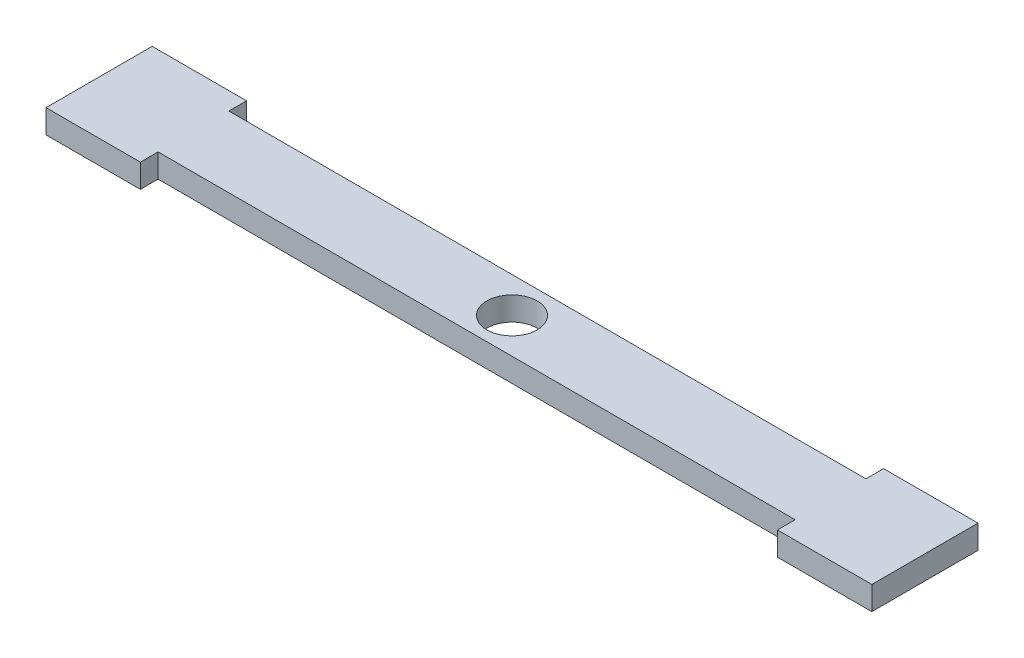
ISO-10303-21;
HEADER;
FILE_DESCRIPTION(('STEP AP214'),'2;1');
FILE_NAME('part.step','',(''),(''),'','','');
FILE_SCHEMA(('AUTOMOTIVE_DESIGN { 1 0 10303 214 1 1 1 1 }'));
ENDSEC;
DATA;
#1=APPLICATION_CONTEXT('core data for automotive mechanical design processes');
#2=APPLICATION_PROTOCOL_DEFINITION('international standard','automotive_design',2000,#1);
#3=PRODUCT_CONTEXT('',#1,'mechanical');
#4=PRODUCT('Part','Part','',(#3));
#5=PRODUCT_RELATED_PRODUCT_CATEGORY('part','',(#4));
#6=PRODUCT_DEFINITION_FORMATION('','',#4);
#7=PRODUCT_DEFINITION_CONTEXT('part definition',#1,'design');
#8=PRODUCT_DEFINITION('design','',#6,#7);
#9=PRODUCT_DEFINITION_SHAPE('','',#8);
#10=(LENGTH_UNIT() NAMED_UNIT(*) SI_UNIT(.MILLI.,.METRE.));
#11=(NAMED_UNIT(*) PLANE_ANGLE_UNIT() SI_UNIT($,.RADIAN.));
#12=(NAMED_UNIT(*) SI_UNIT($,.STERADIAN.) SOLID_ANGLE_UNIT());
#13=UNCERTAINTY_MEASURE_WITH_UNIT(LENGTH_MEASURE(1.E-05),#10,'distance_accuracy_value','');
#14=(GEOMETRIC_REPRESENTATION_CONTEXT(3) GLOBAL_UNCERTAINTY_ASSIGNED_CONTEXT((#13)) GLOBAL_UNIT_ASSIGNED_CONTEXT((#10,
#11,#12)) REPRESENTATION_CONTEXT('',''));
#15=CARTESIAN_POINT('',(0.,0.,0.));
#16=DIRECTION('',(0.,0.,1.));
#17=DIRECTION('',(1.,0.,0.));
#18=AXIS2_PLACEMENT_3D('',#15,#16,#17);
#19=CARTESIAN_POINT('',(0.,10.,0.));
#20=DIRECTION('',(0.,1.,0.));
#21=DIRECTION('',(0.,0.,1.));
#22=AXIS2_PLACEMENT_3D('',#19,#20,#21);
#23=PLANE('',#22);
#24=DIRECTION('',(0.,0.,1.));
#25=VECTOR('',#24,1.);
#26=CARTESIAN_POINT('',(-73.2906760748949,10.,20.));
#27=LINE('',#26,#25);
#28=CARTESIAN_POINT('',(-73.2906760748949,10.,-25.));
#29=VERTEX_POINT('',#28);
#30=CARTESIAN_POINT('',(-73.2906760748949,10.,20.));
#31=VERTEX_POINT('',#30);
#32=EDGE_CURVE('E177',#29,#31,#27,.T.);
#33=ORIENTED_EDGE('',*,*,#32,.T.);
#34=DIRECTION('',(1.,0.,0.));
#35=VECTOR('',#34,1.);
#36=CARTESIAN_POINT('',(-33.290676074895,10.,20.));
#37=LINE('',#36,#35);
#38=CARTESIAN_POINT('',(-33.290676074895,10.,20.));
#39=VERTEX_POINT('',#38);
#40=EDGE_CURVE('E105',#31,#39,#37,.T.);
#41=ORIENTED_EDGE('',*,*,#40,.T.);
#42=DIRECTION('',(0.,0.,-1.));
#43=VECTOR('',#42,1.);
#44=CARTESIAN_POINT('',(-33.290676074895,10.,20.));
#45=LINE('',#44,#43);
#46=CARTESIAN_POINT('',(-33.290676074895,10.,12.5));
#47=VERTEX_POINT('',#46);
#48=EDGE_CURVE('E204',#39,#47,#45,.T.);
#49=ORIENTED_EDGE('',*,*,#48,.T.);
#50=DIRECTION('',(1.,0.,0.));
#51=VECTOR('',#50,1.);
#52=CARTESIAN_POINT('',(-33.290676074895,10.,12.5));
#53=LINE('',#52,#51);
#54=CARTESIAN_POINT('',(236.709323925105,10.,12.5));
#55=VERTEX_POINT('',#54);
#56=EDGE_CURVE('E223',#47,#55,#53,.T.);
#57=ORIENTED_EDGE('',*,*,#56,.T.);
#58=DIRECTION('',(0.,0.,1.));
#59=VECTOR('',#58,1.);
#60=CARTESIAN_POINT('',(236.709323925105,10.,20.));
#61=LINE('',#60,#59);
#62=CARTESIAN_POINT('',(236.709323925105,10.,20.));
#63=VERTEX_POINT('',#62);
#64=EDGE_CURVE('E220',#55,#63,#61,.T.);
#65=ORIENTED_EDGE('',*,*,#64,.T.);
#66=DIRECTION('',(1.,0.,0.));
#67=VECTOR('',#66,1.);
#68=CARTESIAN_POINT('',(276.709323925105,10.,20.));
#69=LINE('',#68,#67);
#70=CARTESIAN_POINT('',(276.709323925105,10.,20.));
#71=VERTEX_POINT('',#70);
#72=EDGE_CURVE('E222',#63,#71,#69,.T.);
#73=ORIENTED_EDGE('',*,*,#72,.T.);
#74=DIRECTION('',(0.,0.,-1.));
#75=VECTOR('',#74,1.);
#76=CARTESIAN_POINT('',(276.709323925105,10.,20.));
#77=LINE('',#76,#75);
#78=CARTESIAN_POINT('',(276.709323925105,10.,-25.));
#79=VERTEX_POINT('',#78);
#80=EDGE_CURVE('E225',#71,#79,#77,.T.);
#81=ORIENTED_EDGE('',*,*,#80,.T.);
#82=DIRECTION('',(-1.,0.,0.));
#83=VECTOR('',#82,1.);
#84=CARTESIAN_POINT('',(276.709323925105,10.,-25.));
#85=LINE('',#84,#83);
#86=CARTESIAN_POINT('',(236.709323925105,10.,-25.));
#87=VERTEX_POINT('',#86);
#88=EDGE_CURVE('E231',#79,#87,#85,.T.);
#89=ORIENTED_EDGE('',*,*,#88,.T.);
#90=DIRECTION('',(0.,0.,1.));
#91=VECTOR('',#90,1.);
#92=CARTESIAN_POINT('',(236.709323925105,10.,-17.5));
#93=LINE('',#92,#91);
#94=CARTESIAN_POINT('',(236.709323925105,10.,-17.5));
#95=VERTEX_POINT('',#94);
#96=EDGE_CURVE('E136',#87,#95,#93,.T.);
#97=ORIENTED_EDGE('',*,*,#96,.T.);
#98=DIRECTION('',(-1.,0.,0.));
#99=VECTOR('',#98,1.);
#100=CARTESIAN_POINT('',(-33.290676074895,10.,-17.5));
#101=LINE('',#100,#99);
#102=CARTESIAN_POINT('',(-33.290676074895,10.,-17.5));
#103=VERTEX_POINT('',#102);
#104=EDGE_CURVE('E130',#95,#103,#101,.T.);
#105=ORIENTED_EDGE('',*,*,#104,.T.);
#106=DIRECTION('',(0.,0.,-1.));
#107=VECTOR('',#106,1.);
#108=CARTESIAN_POINT('',(-33.290676074895,10.,-17.5));
#109=LINE('',#108,#107);
#110=CARTESIAN_POINT('',(-33.290676074895,10.,-25.));
#111=VERTEX_POINT('',#110);
#112=EDGE_CURVE('E134',#103,#111,#109,.T.);
#113=ORIENTED_EDGE('',*,*,#112,.T.);
#114=DIRECTION('',(-1.,0.,0.));
#115=VECTOR('',#114,1.);
#116=CARTESIAN_POINT('',(-33.290676074895,10.,-25.));
#117=LINE('',#116,#115);
#118=EDGE_CURVE('E50',#111,#29,#117,.T.);
#119=ORIENTED_EDGE('',*,*,#118,.T.);
#120=EDGE_LOOP('',(#33,#41,#49,#57,#65,#73,#81,#89,#97,#105,#113,#119));
#121=FACE_BOUND('',#120,.T.);
#122=CARTESIAN_POINT('',(101.709323925105,10.,-2.5));
#123=DIRECTION('',(0.,1.,0.));
#124=DIRECTION('',(0.,0.,1.));
#125=AXIS2_PLACEMENT_3D('',#122,#123,#124);
#126=CIRCLE('',#125,10.65);
#127=CARTESIAN_POINT('',(101.709323925105,10.,8.15));
#128=VERTEX_POINT('',#127);
#129=EDGE_CURVE('E158',#128,#128,#126,.T.);
#130=ORIENTED_EDGE('',*,*,#129,.F.);
#131=EDGE_LOOP('',(#130));
#132=FACE_BOUND('',#131,.T.);
#133=ADVANCED_FACE('F33',(#121,#132),#23,.T.);
#134=CARTESIAN_POINT('',(0.,0.,0.));
#135=DIRECTION('',(0.,1.,0.));
#136=DIRECTION('',(0.,0.,1.));
#137=AXIS2_PLACEMENT_3D('',#134,#135,#136);
#138=PLANE('',#137);
#139=DIRECTION('',(0.,0.,1.));
#140=VECTOR('',#139,1.);
#141=CARTESIAN_POINT('',(-73.2906760748949,0.,20.));
#142=LINE('',#141,#140);
#143=CARTESIAN_POINT('',(-73.2906760748949,0.,-25.));
#144=VERTEX_POINT('',#143);
#145=CARTESIAN_POINT('',(-73.2906760748949,0.,20.));
#146=VERTEX_POINT('',#145);
#147=EDGE_CURVE('E154',#144,#146,#142,.T.);
#148=ORIENTED_EDGE('',*,*,#147,.F.);
#149=DIRECTION('',(-1.,0.,0.));
#150=VECTOR('',#149,1.);
#151=CARTESIAN_POINT('',(-33.290676074895,0.,-25.));
#152=LINE('',#151,#150);
#153=CARTESIAN_POINT('',(-33.290676074895,0.,-25.));
#154=VERTEX_POINT('',#153);
#155=EDGE_CURVE('E97',#154,#144,#152,.T.);
#156=ORIENTED_EDGE('',*,*,#155,.F.);
#157=DIRECTION('',(0.,0.,-1.));
#158=VECTOR('',#157,1.);
#159=CARTESIAN_POINT('',(-33.290676074895,0.,-17.5));
#160=LINE('',#159,#158);
#161=CARTESIAN_POINT('',(-33.290676074895,0.,-17.5));
#162=VERTEX_POINT('',#161);
#163=EDGE_CURVE('E91',#162,#154,#160,.T.);
#164=ORIENTED_EDGE('',*,*,#163,.F.);
#165=DIRECTION('',(-1.,0.,0.));
#166=VECTOR('',#165,1.);
#167=CARTESIAN_POINT('',(-33.290676074895,0.,-17.5));
#168=LINE('',#167,#166);
#169=CARTESIAN_POINT('',(236.709323925105,0.,-17.5));
#170=VERTEX_POINT('',#169);
#171=EDGE_CURVE('E144',#170,#162,#168,.T.);
#172=ORIENTED_EDGE('',*,*,#171,.F.);
#173=DIRECTION('',(0.,0.,1.));
#174=VECTOR('',#173,1.);
#175=CARTESIAN_POINT('',(236.709323925105,0.,-17.5));
#176=LINE('',#175,#174);
#177=CARTESIAN_POINT('',(236.709323925105,0.,-25.));
#178=VERTEX_POINT('',#177);
#179=EDGE_CURVE('E172',#178,#170,#176,.T.);
#180=ORIENTED_EDGE('',*,*,#179,.F.);
#181=DIRECTION('',(-1.,0.,0.));
#182=VECTOR('',#181,1.);
#183=CARTESIAN_POINT('',(276.709323925105,0.,-25.));
#184=LINE('',#183,#182);
#185=CARTESIAN_POINT('',(276.709323925105,0.,-25.));
#186=VERTEX_POINT('',#185);
#187=EDGE_CURVE('E170',#186,#178,#184,.T.);
#188=ORIENTED_EDGE('',*,*,#187,.F.);
#189=DIRECTION('',(0.,0.,-1.));
#190=VECTOR('',#189,1.);
#191=CARTESIAN_POINT('',(276.709323925105,0.,20.));
#192=LINE('',#191,#190);
#193=CARTESIAN_POINT('',(276.709323925105,0.,20.));
#194=VERTEX_POINT('',#193);
#195=EDGE_CURVE('E168',#194,#186,#192,.T.);
#196=ORIENTED_EDGE('',*,*,#195,.F.);
#197=DIRECTION('',(1.,0.,0.));
#198=VECTOR('',#197,1.);
#199=CARTESIAN_POINT('',(276.709323925105,0.,20.));
#200=LINE('',#199,#198);
#201=CARTESIAN_POINT('',(236.709323925105,0.,20.));
#202=VERTEX_POINT('',#201);
#203=EDGE_CURVE('E166',#202,#194,#200,.T.);
#204=ORIENTED_EDGE('',*,*,#203,.F.);
#205=DIRECTION('',(0.,0.,1.));
#206=VECTOR('',#205,1.);
#207=CARTESIAN_POINT('',(236.709323925105,0.,20.));
#208=LINE('',#207,#206);
#209=CARTESIAN_POINT('',(236.709323925105,0.,12.5));
#210=VERTEX_POINT('',#209);
#211=EDGE_CURVE('E164',#210,#202,#208,.T.);
#212=ORIENTED_EDGE('',*,*,#211,.F.);
#213=DIRECTION('',(1.,0.,0.));
#214=VECTOR('',#213,1.);
#215=CARTESIAN_POINT('',(-33.290676074895,0.,12.5));
#216=LINE('',#215,#214);
#217=CARTESIAN_POINT('',(-33.290676074895,0.,12.5));
#218=VERTEX_POINT('',#217);
#219=EDGE_CURVE('E162',#218,#210,#216,.T.);
#220=ORIENTED_EDGE('',*,*,#219,.F.);
#221=DIRECTION('',(0.,0.,-1.));
#222=VECTOR('',#221,1.);
#223=CARTESIAN_POINT('',(-33.290676074895,0.,20.));
#224=LINE('',#223,#222);
#225=CARTESIAN_POINT('',(-33.290676074895,0.,20.));
#226=VERTEX_POINT('',#225);
#227=EDGE_CURVE('E160',#226,#218,#224,.T.);
#228=ORIENTED_EDGE('',*,*,#227,.F.);
#229=DIRECTION('',(1.,0.,0.));
#230=VECTOR('',#229,1.);
#231=CARTESIAN_POINT('',(-33.290676074895,0.,20.));
#232=LINE('',#231,#230);
#233=EDGE_CURVE('E157',#146,#226,#232,.T.);
#234=ORIENTED_EDGE('',*,*,#233,.F.);
#235=EDGE_LOOP('',(#148,#156,#164,#172,#180,#188,#196,#204,#212,#220,#228,#234));
#236=FACE_BOUND('',#235,.T.);
#237=CARTESIAN_POINT('',(101.709323925105,0.,-2.5));
#238=DIRECTION('',(0.,1.,0.));
#239=DIRECTION('',(0.,0.,1.));
#240=AXIS2_PLACEMENT_3D('',#237,#238,#239);
#241=CIRCLE('',#240,10.65);
#242=CARTESIAN_POINT('',(101.709323925105,0.,8.15));
#243=VERTEX_POINT('',#242);
#244=EDGE_CURVE('E378',#243,#243,#241,.T.);
#245=ORIENTED_EDGE('',*,*,#244,.T.);
#246=EDGE_LOOP('',(#245));
#247=FACE_BOUND('',#246,.T.);
#248=ADVANCED_FACE('F208',(#236,#247),#138,.F.);
#249=CARTESIAN_POINT('',(-73.2906760748949,10.,20.));
#250=DIRECTION('',(1.,0.,0.));
#251=DIRECTION('',(0.,0.,-1.));
#252=AXIS2_PLACEMENT_3D('',#249,#250,#251);
#253=PLANE('',#252);
#254=ORIENTED_EDGE('',*,*,#147,.T.);
#255=DIRECTION('',(0.,-1.,0.));
#256=VECTOR('',#255,1.);
#257=CARTESIAN_POINT('',(-73.2906760748949,10.,20.));
#258=LINE('',#257,#256);
#259=EDGE_CURVE('E11',#31,#146,#258,.T.);
#260=ORIENTED_EDGE('',*,*,#259,.F.);
#261=ORIENTED_EDGE('',*,*,#32,.F.);
#262=DIRECTION('',(0.,-1.,0.));
#263=VECTOR('',#262,1.);
#264=CARTESIAN_POINT('',(-73.2906760748949,10.,-25.));
#265=LINE('',#264,#263);
#266=EDGE_CURVE('E150',#29,#144,#265,.T.);
#267=ORIENTED_EDGE('',*,*,#266,.T.);
#268=EDGE_LOOP('',(#254,#260,#261,#267));
#269=FACE_BOUND('',#268,.T.);
#270=ADVANCED_FACE('F35',(#269),#253,.F.);
#271=CARTESIAN_POINT('',(-33.290676074895,10.,20.));
#272=DIRECTION('',(0.,0.,-1.));
#273=DIRECTION('',(-1.,0.,0.));
#274=AXIS2_PLACEMENT_3D('',#271,#272,#273);
#275=PLANE('',#274);
#276=ORIENTED_EDGE('',*,*,#233,.T.);
#277=DIRECTION('',(0.,-1.,0.));
#278=VECTOR('',#277,1.);
#279=CARTESIAN_POINT('',(-33.290676074895,10.,20.));
#280=LINE('',#279,#278);
#281=EDGE_CURVE('E42',#39,#226,#280,.T.);
#282=ORIENTED_EDGE('',*,*,#281,.F.);
#283=ORIENTED_EDGE('',*,*,#40,.F.);
#284=ORIENTED_EDGE('',*,*,#259,.T.);
#285=EDGE_LOOP('',(#276,#282,#283,#284));
#286=FACE_BOUND('',#285,.T.);
#287=ADVANCED_FACE('F265',(#286),#275,.F.);
#288=CARTESIAN_POINT('',(-33.290676074895,10.,20.));
#289=DIRECTION('',(-1.,0.,0.));
#290=DIRECTION('',(0.,0.,1.));
#291=AXIS2_PLACEMENT_3D('',#288,#289,#290);
#292=PLANE('',#291);
#293=ORIENTED_EDGE('',*,*,#227,.T.);
#294=DIRECTION('',(0.,-1.,0.));
#295=VECTOR('',#294,1.);
#296=CARTESIAN_POINT('',(-33.290676074895,10.,12.5));
#297=LINE('',#296,#295);
#298=EDGE_CURVE('E196',#47,#218,#297,.T.);
#299=ORIENTED_EDGE('',*,*,#298,.F.);
#300=ORIENTED_EDGE('',*,*,#48,.F.);
#301=ORIENTED_EDGE('',*,*,#281,.T.);
#302=EDGE_LOOP('',(#293,#299,#300,#301));
#303=FACE_BOUND('',#302,.T.);
#304=ADVANCED_FACE('F202',(#303),#292,.F.);
#305=CARTESIAN_POINT('',(-33.290676074895,10.,12.5));
#306=DIRECTION('',(0.,0.,-1.));
#307=DIRECTION('',(-1.,0.,0.));
#308=AXIS2_PLACEMENT_3D('',#305,#306,#307);
#309=PLANE('',#308);
#310=ORIENTED_EDGE('',*,*,#219,.T.);
#311=DIRECTION('',(0.,-1.,0.));
#312=VECTOR('',#311,1.);
#313=CARTESIAN_POINT('',(236.709323925105,10.,12.5));
#314=LINE('',#313,#312);
#315=EDGE_CURVE('E193',#55,#210,#314,.T.);
#316=ORIENTED_EDGE('',*,*,#315,.F.);
#317=ORIENTED_EDGE('',*,*,#56,.F.);
#318=ORIENTED_EDGE('',*,*,#298,.T.);
#319=EDGE_LOOP('',(#310,#316,#317,#318));
#320=FACE_BOUND('',#319,.T.);
#321=ADVANCED_FACE('F214',(#320),#309,.F.);
#322=CARTESIAN_POINT('',(236.709323925105,10.,20.));
#323=DIRECTION('',(1.,0.,0.));
#324=DIRECTION('',(0.,0.,-1.));
#325=AXIS2_PLACEMENT_3D('',#322,#323,#324);
#326=PLANE('',#325);
#327=ORIENTED_EDGE('',*,*,#211,.T.);
#328=DIRECTION('',(0.,-1.,0.));
#329=VECTOR('',#328,1.);
#330=CARTESIAN_POINT('',(236.709323925105,10.,20.));
#331=LINE('',#330,#329);
#332=EDGE_CURVE('E190',#63,#202,#331,.T.);
#333=ORIENTED_EDGE('',*,*,#332,.F.);
#334=ORIENTED_EDGE('',*,*,#64,.F.);
#335=ORIENTED_EDGE('',*,*,#315,.T.);
#336=EDGE_LOOP('',(#327,#333,#334,#335));
#337=FACE_BOUND('',#336,.T.);
#338=ADVANCED_FACE('F218',(#337),#326,.F.);
#339=CARTESIAN_POINT('',(276.709323925105,10.,20.));
#340=DIRECTION('',(0.,0.,-1.));
#341=DIRECTION('',(-1.,0.,0.));
#342=AXIS2_PLACEMENT_3D('',#339,#340,#341);
#343=PLANE('',#342);
#344=ORIENTED_EDGE('',*,*,#203,.T.);
#345=DIRECTION('',(0.,-1.,0.));
#346=VECTOR('',#345,1.);
#347=CARTESIAN_POINT('',(276.709323925105,10.,20.));
#348=LINE('',#347,#346);
#349=EDGE_CURVE('E187',#71,#194,#348,.T.);
#350=ORIENTED_EDGE('',*,*,#349,.F.);
#351=ORIENTED_EDGE('',*,*,#72,.F.);
#352=ORIENTED_EDGE('',*,*,#332,.T.);
#353=EDGE_LOOP('',(#344,#350,#351,#352));
#354=FACE_BOUND('',#353,.T.);
#355=ADVANCED_FACE('F278',(#354),#343,.F.);
#356=CARTESIAN_POINT('',(276.709323925105,10.,20.));
#357=DIRECTION('',(-1.,0.,0.));
#358=DIRECTION('',(0.,0.,1.));
#359=AXIS2_PLACEMENT_3D('',#356,#357,#358);
#360=PLANE('',#359);
#361=ORIENTED_EDGE('',*,*,#195,.T.);
#362=DIRECTION('',(0.,-1.,0.));
#363=VECTOR('',#362,1.);
#364=CARTESIAN_POINT('',(276.709323925105,10.,-25.));
#365=LINE('',#364,#363);
#366=EDGE_CURVE('E184',#79,#186,#365,.T.);
#367=ORIENTED_EDGE('',*,*,#366,.F.);
#368=ORIENTED_EDGE('',*,*,#80,.F.);
#369=ORIENTED_EDGE('',*,*,#349,.T.);
#370=EDGE_LOOP('',(#361,#367,#368,#369));
#371=FACE_BOUND('',#370,.T.);
#372=ADVANCED_FACE('F281',(#371),#360,.F.);
#373=CARTESIAN_POINT('',(276.709323925105,10.,-25.));
#374=DIRECTION('',(0.,0.,1.));
#375=DIRECTION('',(1.,0.,0.));
#376=AXIS2_PLACEMENT_3D('',#373,#374,#375);
#377=PLANE('',#376);
#378=ORIENTED_EDGE('',*,*,#187,.T.);
#379=DIRECTION('',(0.,-1.,0.));
#380=VECTOR('',#379,1.);
#381=CARTESIAN_POINT('',(236.709323925105,10.,-25.));
#382=LINE('',#381,#380);
#383=EDGE_CURVE('E181',#87,#178,#382,.T.);
#384=ORIENTED_EDGE('',*,*,#383,.F.);
#385=ORIENTED_EDGE('',*,*,#88,.F.);
#386=ORIENTED_EDGE('',*,*,#366,.T.);
#387=EDGE_LOOP('',(#378,#384,#385,#386));
#388=FACE_BOUND('',#387,.T.);
#389=ADVANCED_FACE('F237',(#388),#377,.F.);
#390=CARTESIAN_POINT('',(236.709323925105,10.,-17.5));
#391=DIRECTION('',(1.,0.,0.));
#392=DIRECTION('',(0.,0.,-1.));
#393=AXIS2_PLACEMENT_3D('',#390,#391,#392);
#394=PLANE('',#393);
#395=ORIENTED_EDGE('',*,*,#179,.T.);
#396=DIRECTION('',(0.,-1.,0.));
#397=VECTOR('',#396,1.);
#398=CARTESIAN_POINT('',(236.709323925105,10.,-17.5));
#399=LINE('',#398,#397);
#400=EDGE_CURVE('E145',#95,#170,#399,.T.);
#401=ORIENTED_EDGE('',*,*,#400,.F.);
#402=ORIENTED_EDGE('',*,*,#96,.F.);
#403=ORIENTED_EDGE('',*,*,#383,.T.);
#404=EDGE_LOOP('',(#395,#401,#402,#403));
#405=FACE_BOUND('',#404,.T.);
#406=ADVANCED_FACE('F241',(#405),#394,.F.);
#407=CARTESIAN_POINT('',(-33.290676074895,10.,-17.5));
#408=DIRECTION('',(0.,0.,1.));
#409=DIRECTION('',(1.,0.,0.));
#410=AXIS2_PLACEMENT_3D('',#407,#408,#409);
#411=PLANE('',#410);
#412=ORIENTED_EDGE('',*,*,#171,.T.);
#413=DIRECTION('',(0.,-1.,0.));
#414=VECTOR('',#413,1.);
#415=CARTESIAN_POINT('',(-33.290676074895,10.,-17.5));
#416=LINE('',#415,#414);
#417=EDGE_CURVE('E141',#103,#162,#416,.T.);
#418=ORIENTED_EDGE('',*,*,#417,.F.);
#419=ORIENTED_EDGE('',*,*,#104,.F.);
#420=ORIENTED_EDGE('',*,*,#400,.T.);
#421=EDGE_LOOP('',(#412,#418,#419,#420));
#422=FACE_BOUND('',#421,.T.);
#423=ADVANCED_FACE('F142',(#422),#411,.F.);
#424=CARTESIAN_POINT('',(-33.290676074895,10.,-17.5));
#425=DIRECTION('',(-1.,0.,0.));
#426=DIRECTION('',(0.,0.,1.));
#427=AXIS2_PLACEMENT_3D('',#424,#425,#426);
#428=PLANE('',#427);
#429=ORIENTED_EDGE('',*,*,#163,.T.);
#430=DIRECTION('',(0.,-1.,0.));
#431=VECTOR('',#430,1.);
#432=CARTESIAN_POINT('',(-33.290676074895,10.,-25.));
#433=LINE('',#432,#431);
#434=EDGE_CURVE('E146',#111,#154,#433,.T.);
#435=ORIENTED_EDGE('',*,*,#434,.F.);
#436=ORIENTED_EDGE('',*,*,#112,.F.);
#437=ORIENTED_EDGE('',*,*,#417,.T.);
#438=EDGE_LOOP('',(#429,#435,#436,#437));
#439=FACE_BOUND('',#438,.T.);
#440=ADVANCED_FACE('F148',(#439),#428,.F.);
#441=CARTESIAN_POINT('',(-33.290676074895,10.,-25.));
#442=DIRECTION('',(0.,0.,1.));
#443=DIRECTION('',(1.,0.,0.));
#444=AXIS2_PLACEMENT_3D('',#441,#442,#443);
#445=PLANE('',#444);
#446=ORIENTED_EDGE('',*,*,#155,.T.);
#447=ORIENTED_EDGE('',*,*,#266,.F.);
#448=ORIENTED_EDGE('',*,*,#118,.F.);
#449=ORIENTED_EDGE('',*,*,#434,.T.);
#450=EDGE_LOOP('',(#446,#447,#448,#449));
#451=FACE_BOUND('',#450,.T.);
#452=ADVANCED_FACE('F245',(#451),#445,.F.);
#453=CARTESIAN_POINT('',(101.709323925105,10.,-2.5));
#454=DIRECTION('',(0.,-1.,0.));
#455=DIRECTION('',(0.,0.,-1.));
#456=AXIS2_PLACEMENT_3D('',#453,#454,#455);
#457=CYLINDRICAL_SURFACE('',#456,10.65);
#458=ORIENTED_EDGE('',*,*,#129,.T.);
#459=EDGE_LOOP('',(#458));
#460=FACE_BOUND('',#459,.T.);
#461=ORIENTED_EDGE('',*,*,#244,.F.);
#462=EDGE_LOOP('',(#461));
#463=FACE_BOUND('',#462,.T.);
#464=ADVANCED_FACE('F247',(#460,#463),#457,.F.);
#465=CLOSED_SHELL('',(#133,#248,#270,#287,#304,#321,#338,#355,#372,#389,#406,#423,#440,#452,#464));
#466=MANIFOLD_SOLID_BREP('B2',#465);
#467=ADVANCED_BREP_SHAPE_REPRESENTATION('',(#18,#466),#14);
#468=SHAPE_DEFINITION_REPRESENTATION(#9,#467);
ENDSEC;
END-ISO-10303-21;
